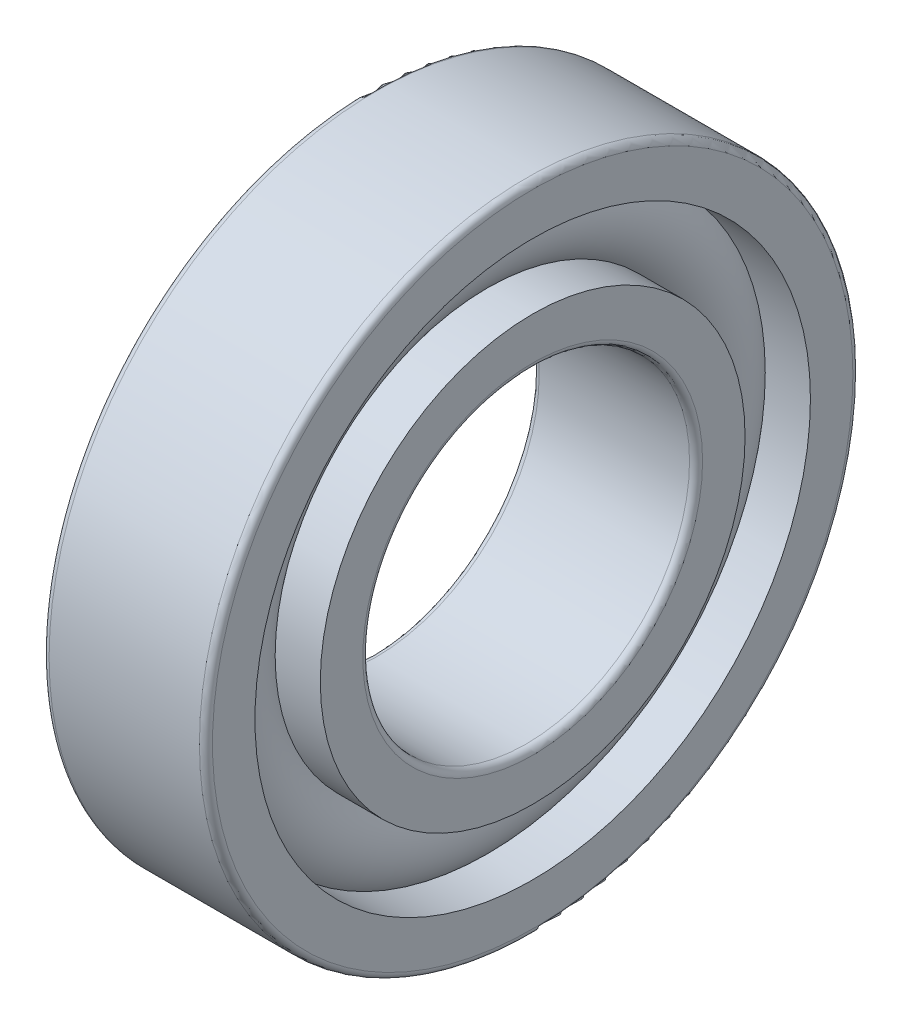
ISO-10303-21;
HEADER;
FILE_DESCRIPTION(('STEP AP214'),'2;1');
FILE_NAME('part.step','',(''),(''),'','','');
FILE_SCHEMA(('AUTOMOTIVE_DESIGN { 1 0 10303 214 1 1 1 1 }'));
ENDSEC;
DATA;
#1=APPLICATION_CONTEXT('core data for automotive mechanical design processes');
#2=APPLICATION_PROTOCOL_DEFINITION('international standard','automotive_design',2000,#1);
#3=PRODUCT_CONTEXT('',#1,'mechanical');
#4=PRODUCT('Part','Part','',(#3));
#5=PRODUCT_RELATED_PRODUCT_CATEGORY('part','',(#4));
#6=PRODUCT_DEFINITION_FORMATION('','',#4);
#7=PRODUCT_DEFINITION_CONTEXT('part definition',#1,'design');
#8=PRODUCT_DEFINITION('design','',#6,#7);
#9=PRODUCT_DEFINITION_SHAPE('','',#8);
#10=(LENGTH_UNIT() NAMED_UNIT(*) SI_UNIT(.MILLI.,.METRE.));
#11=(NAMED_UNIT(*) PLANE_ANGLE_UNIT() SI_UNIT($,.RADIAN.));
#12=(NAMED_UNIT(*) SI_UNIT($,.STERADIAN.) SOLID_ANGLE_UNIT());
#13=UNCERTAINTY_MEASURE_WITH_UNIT(LENGTH_MEASURE(1.E-05),#10,'distance_accuracy_value','');
#14=(GEOMETRIC_REPRESENTATION_CONTEXT(3) GLOBAL_UNCERTAINTY_ASSIGNED_CONTEXT((#13)) GLOBAL_UNIT_ASSIGNED_CONTEXT((#10,
#11,#12)) REPRESENTATION_CONTEXT('',''));
#15=CARTESIAN_POINT('',(0.,0.,0.));
#16=DIRECTION('',(0.,0.,1.));
#17=DIRECTION('',(1.,0.,0.));
#18=AXIS2_PLACEMENT_3D('',#15,#16,#17);
#19=CARTESIAN_POINT('',(0.,0.,0.));
#20=DIRECTION('',(-1.,0.,0.));
#21=DIRECTION('',(0.,0.,1.));
#22=AXIS2_PLACEMENT_3D('',#19,#20,#21);
#23=TOROIDAL_SURFACE('',#22,4.7625,0.9525);
#24=CARTESIAN_POINT('',(0.709951582856179,0.,0.));
#25=DIRECTION('',(-1.,0.,0.));
#26=DIRECTION('',(0.,0.,1.));
#27=AXIS2_PLACEMENT_3D('',#24,#25,#26);
#28=CIRCLE('',#27,5.3975);
#29=CARTESIAN_POINT('',(0.709951582856179,0.,5.3975));
#30=VERTEX_POINT('',#29);
#31=EDGE_CURVE('E35',#30,#30,#28,.F.);
#32=ORIENTED_EDGE('',*,*,#31,.T.);
#33=EDGE_LOOP('',(#32));
#34=FACE_BOUND('',#33,.T.);
#35=CARTESIAN_POINT('',(0.709951582856183,0.,0.));
#36=DIRECTION('',(-1.,0.,0.));
#37=DIRECTION('',(0.,0.,1.));
#38=AXIS2_PLACEMENT_3D('',#35,#36,#37);
#39=CIRCLE('',#38,4.1275);
#40=CARTESIAN_POINT('',(0.709951582856183,0.,4.1275));
#41=VERTEX_POINT('',#40);
#42=EDGE_CURVE('E10',#41,#41,#39,.T.);
#43=ORIENTED_EDGE('',*,*,#42,.T.);
#44=EDGE_LOOP('',(#43));
#45=FACE_BOUND('',#44,.T.);
#46=ADVANCED_FACE('F31',(#34,#45),#23,.T.);
#47=CARTESIAN_POINT('',(-20.6375,0.,0.));
#48=DIRECTION('',(1.,0.,0.));
#49=DIRECTION('',(0.,0.,-1.));
#50=AXIS2_PLACEMENT_3D('',#47,#48,#49);
#51=CYLINDRICAL_SURFACE('',#50,4.1275);
#52=CARTESIAN_POINT('',(1.5875,0.,0.));
#53=DIRECTION('',(1.,0.,0.));
#54=DIRECTION('',(0.,0.,-1.));
#55=AXIS2_PLACEMENT_3D('',#52,#53,#54);
#56=CIRCLE('',#55,4.1275);
#57=CARTESIAN_POINT('',(1.5875,0.,-4.1275));
#58=VERTEX_POINT('',#57);
#59=EDGE_CURVE('E44',#58,#58,#56,.T.);
#60=ORIENTED_EDGE('',*,*,#59,.F.);
#61=EDGE_LOOP('',(#60));
#62=FACE_BOUND('',#61,.T.);
#63=ORIENTED_EDGE('',*,*,#42,.F.);
#64=EDGE_LOOP('',(#63));
#65=FACE_BOUND('',#64,.T.);
#66=ADVANCED_FACE('F83',(#62,#65),#51,.T.);
#67=CARTESIAN_POINT('',(-20.6375,0.,0.));
#68=DIRECTION('',(1.,0.,0.));
#69=DIRECTION('',(0.,0.,-1.));
#70=AXIS2_PLACEMENT_3D('',#67,#68,#69);
#71=CYLINDRICAL_SURFACE('',#70,4.1275);
#72=CARTESIAN_POINT('',(-1.5875,0.,0.));
#73=DIRECTION('',(1.,0.,0.));
#74=DIRECTION('',(0.,0.,-1.));
#75=AXIS2_PLACEMENT_3D('',#72,#73,#74);
#76=CIRCLE('',#75,4.1275);
#77=CARTESIAN_POINT('',(-1.5875,0.,-4.1275));
#78=VERTEX_POINT('',#77);
#79=EDGE_CURVE('E53',#78,#78,#76,.T.);
#80=ORIENTED_EDGE('',*,*,#79,.T.);
#81=EDGE_LOOP('',(#80));
#82=FACE_BOUND('',#81,.T.);
#83=CARTESIAN_POINT('',(-0.709951582856183,0.,0.));
#84=DIRECTION('',(1.,0.,0.));
#85=DIRECTION('',(0.,0.,-1.));
#86=AXIS2_PLACEMENT_3D('',#83,#84,#85);
#87=CIRCLE('',#86,4.1275);
#88=CARTESIAN_POINT('',(-0.709951582856183,0.,-4.1275));
#89=VERTEX_POINT('',#88);
#90=EDGE_CURVE('E39',#89,#89,#87,.T.);
#91=ORIENTED_EDGE('',*,*,#90,.F.);
#92=EDGE_LOOP('',(#91));
#93=FACE_BOUND('',#92,.T.);
#94=ADVANCED_FACE('F86',(#82,#93),#71,.T.);
#95=CARTESIAN_POINT('',(1.5875,3.302,0.));
#96=DIRECTION('',(1.,0.,0.));
#97=DIRECTION('',(0.,0.,-1.));
#98=AXIS2_PLACEMENT_3D('',#95,#96,#97);
#99=PLANE('',#98);
#100=ORIENTED_EDGE('',*,*,#59,.T.);
#101=EDGE_LOOP('',(#100));
#102=FACE_BOUND('',#101,.T.);
#103=CARTESIAN_POINT('',(1.5875,0.,0.));
#104=DIRECTION('',(1.,0.,0.));
#105=DIRECTION('',(0.,0.,-1.));
#106=AXIS2_PLACEMENT_3D('',#103,#104,#105);
#107=CIRCLE('',#106,3.302);
#108=CARTESIAN_POINT('',(1.5875,0.,-3.302));
#109=VERTEX_POINT('',#108);
#110=EDGE_CURVE('E75',#109,#109,#107,.T.);
#111=ORIENTED_EDGE('',*,*,#110,.F.);
#112=EDGE_LOOP('',(#111));
#113=FACE_BOUND('',#112,.T.);
#114=ADVANCED_FACE('F80',(#102,#113),#99,.T.);
#115=CARTESIAN_POINT('',(1.4605,0.,0.));
#116=DIRECTION('',(1.,0.,0.));
#117=DIRECTION('',(0.,0.,-1.));
#118=AXIS2_PLACEMENT_3D('',#115,#116,#117);
#119=TOROIDAL_SURFACE('',#118,3.302,0.127);
#120=ORIENTED_EDGE('',*,*,#110,.T.);
#121=EDGE_LOOP('',(#120));
#122=FACE_BOUND('',#121,.T.);
#123=CARTESIAN_POINT('',(1.4605,0.,0.));
#124=DIRECTION('',(1.,0.,0.));
#125=DIRECTION('',(0.,0.,-1.));
#126=AXIS2_PLACEMENT_3D('',#123,#124,#125);
#127=CIRCLE('',#126,3.175);
#128=CARTESIAN_POINT('',(1.4605,0.,-3.175));
#129=VERTEX_POINT('',#128);
#130=EDGE_CURVE('E72',#129,#129,#127,.T.);
#131=ORIENTED_EDGE('',*,*,#130,.F.);
#132=EDGE_LOOP('',(#131));
#133=FACE_BOUND('',#132,.T.);
#134=ADVANCED_FACE('F97',(#122,#133),#119,.T.);
#135=CARTESIAN_POINT('',(-20.6375,0.,0.));
#136=DIRECTION('',(1.,0.,0.));
#137=DIRECTION('',(0.,0.,-1.));
#138=AXIS2_PLACEMENT_3D('',#135,#136,#137);
#139=CYLINDRICAL_SURFACE('',#138,3.175);
#140=ORIENTED_EDGE('',*,*,#130,.T.);
#141=EDGE_LOOP('',(#140));
#142=FACE_BOUND('',#141,.T.);
#143=CARTESIAN_POINT('',(-1.4605,0.,0.));
#144=DIRECTION('',(1.,0.,0.));
#145=DIRECTION('',(0.,0.,-1.));
#146=AXIS2_PLACEMENT_3D('',#143,#144,#145);
#147=CIRCLE('',#146,3.175);
#148=CARTESIAN_POINT('',(-1.4605,0.,-3.175));
#149=VERTEX_POINT('',#148);
#150=EDGE_CURVE('E69',#149,#149,#147,.T.);
#151=ORIENTED_EDGE('',*,*,#150,.F.);
#152=EDGE_LOOP('',(#151));
#153=FACE_BOUND('',#152,.T.);
#154=ADVANCED_FACE('F100',(#142,#153),#139,.F.);
#155=CARTESIAN_POINT('',(-1.4605,0.,0.));
#156=DIRECTION('',(1.,0.,0.));
#157=DIRECTION('',(0.,0.,-1.));
#158=AXIS2_PLACEMENT_3D('',#155,#156,#157);
#159=TOROIDAL_SURFACE('',#158,3.302,0.127);
#160=ORIENTED_EDGE('',*,*,#150,.T.);
#161=EDGE_LOOP('',(#160));
#162=FACE_BOUND('',#161,.T.);
#163=CARTESIAN_POINT('',(-1.5875,0.,0.));
#164=DIRECTION('',(1.,0.,0.));
#165=DIRECTION('',(0.,0.,-1.));
#166=AXIS2_PLACEMENT_3D('',#163,#164,#165);
#167=CIRCLE('',#166,3.302);
#168=CARTESIAN_POINT('',(-1.5875,0.,-3.302));
#169=VERTEX_POINT('',#168);
#170=EDGE_CURVE('E66',#169,#169,#167,.T.);
#171=ORIENTED_EDGE('',*,*,#170,.F.);
#172=EDGE_LOOP('',(#171));
#173=FACE_BOUND('',#172,.T.);
#174=ADVANCED_FACE('F104',(#162,#173),#159,.T.);
#175=CARTESIAN_POINT('',(-1.5875,4.1275,0.));
#176=DIRECTION('',(-1.,0.,0.));
#177=DIRECTION('',(0.,0.,1.));
#178=AXIS2_PLACEMENT_3D('',#175,#176,#177);
#179=PLANE('',#178);
#180=ORIENTED_EDGE('',*,*,#170,.T.);
#181=EDGE_LOOP('',(#180));
#182=FACE_BOUND('',#181,.T.);
#183=ORIENTED_EDGE('',*,*,#79,.F.);
#184=EDGE_LOOP('',(#183));
#185=FACE_BOUND('',#184,.T.);
#186=ADVANCED_FACE('F108',(#182,#185),#179,.T.);
#187=CARTESIAN_POINT('',(-0.709951582856179,0.,0.));
#188=DIRECTION('',(1.,0.,0.));
#189=DIRECTION('',(0.,0.,-1.));
#190=AXIS2_PLACEMENT_3D('',#187,#188,#189);
#191=CIRCLE('',#190,5.3975);
#192=CARTESIAN_POINT('',(-0.709951582856179,0.,-5.3975));
#193=VERTEX_POINT('',#192);
#194=EDGE_CURVE('E47',#193,#193,#191,.F.);
#195=ORIENTED_EDGE('',*,*,#194,.T.);
#196=EDGE_LOOP('',(#195));
#197=FACE_BOUND('',#196,.T.);
#198=ORIENTED_EDGE('',*,*,#90,.T.);
#199=EDGE_LOOP('',(#198));
#200=FACE_BOUND('',#199,.T.);
#201=ADVANCED_FACE('F33',(#197,#200),#23,.T.);
#202=CARTESIAN_POINT('',(-20.6375,0.,0.));
#203=DIRECTION('',(1.,0.,0.));
#204=DIRECTION('',(0.,0.,-1.));
#205=AXIS2_PLACEMENT_3D('',#202,#203,#204);
#206=CYLINDRICAL_SURFACE('',#205,5.3975);
#207=CARTESIAN_POINT('',(1.5875,0.,0.));
#208=DIRECTION('',(1.,0.,0.));
#209=DIRECTION('',(0.,0.,-1.));
#210=AXIS2_PLACEMENT_3D('',#207,#208,#209);
#211=CIRCLE('',#210,5.3975);
#212=CARTESIAN_POINT('',(1.5875,0.,-5.3975));
#213=VERTEX_POINT('',#212);
#214=EDGE_CURVE('E49',#213,#213,#211,.T.);
#215=ORIENTED_EDGE('',*,*,#214,.T.);
#216=EDGE_LOOP('',(#215));
#217=FACE_BOUND('',#216,.T.);
#218=ORIENTED_EDGE('',*,*,#31,.F.);
#219=EDGE_LOOP('',(#218));
#220=FACE_BOUND('',#219,.T.);
#221=ADVANCED_FACE('F113',(#217,#220),#206,.F.);
#222=CARTESIAN_POINT('',(-20.6375,0.,0.));
#223=DIRECTION('',(1.,0.,0.));
#224=DIRECTION('',(0.,0.,-1.));
#225=AXIS2_PLACEMENT_3D('',#222,#223,#224);
#226=CYLINDRICAL_SURFACE('',#225,5.3975);
#227=CARTESIAN_POINT('',(-1.5875,0.,0.));
#228=DIRECTION('',(1.,0.,0.));
#229=DIRECTION('',(0.,0.,-1.));
#230=AXIS2_PLACEMENT_3D('',#227,#228,#229);
#231=CIRCLE('',#230,5.3975);
#232=CARTESIAN_POINT('',(-1.5875,0.,-5.3975));
#233=VERTEX_POINT('',#232);
#234=EDGE_CURVE('E144',#233,#233,#231,.T.);
#235=ORIENTED_EDGE('',*,*,#234,.F.);
#236=EDGE_LOOP('',(#235));
#237=FACE_BOUND('',#236,.T.);
#238=ORIENTED_EDGE('',*,*,#194,.F.);
#239=EDGE_LOOP('',(#238));
#240=FACE_BOUND('',#239,.T.);
#241=ADVANCED_FACE('F116',(#237,#240),#226,.F.);
#242=CARTESIAN_POINT('',(1.5875,6.223,0.));
#243=DIRECTION('',(1.,0.,0.));
#244=DIRECTION('',(0.,0.,-1.));
#245=AXIS2_PLACEMENT_3D('',#242,#243,#244);
#246=PLANE('',#245);
#247=CARTESIAN_POINT('',(1.5875,0.,0.));
#248=DIRECTION('',(1.,0.,0.));
#249=DIRECTION('',(0.,0.,-1.));
#250=AXIS2_PLACEMENT_3D('',#247,#248,#249);
#251=CIRCLE('',#250,6.223);
#252=CARTESIAN_POINT('',(1.5875,0.,-6.223));
#253=VERTEX_POINT('',#252);
#254=EDGE_CURVE('E55',#253,#253,#251,.T.);
#255=ORIENTED_EDGE('',*,*,#254,.T.);
#256=EDGE_LOOP('',(#255));
#257=FACE_BOUND('',#256,.T.);
#258=ORIENTED_EDGE('',*,*,#214,.F.);
#259=EDGE_LOOP('',(#258));
#260=FACE_BOUND('',#259,.T.);
#261=ADVANCED_FACE('F117',(#257,#260),#246,.T.);
#262=CARTESIAN_POINT('',(1.4605,0.,0.));
#263=DIRECTION('',(1.,0.,0.));
#264=DIRECTION('',(0.,0.,-1.));
#265=AXIS2_PLACEMENT_3D('',#262,#263,#264);
#266=TOROIDAL_SURFACE('',#265,6.223,0.127);
#267=CARTESIAN_POINT('',(1.4605,0.,0.));
#268=DIRECTION('',(1.,0.,0.));
#269=DIRECTION('',(0.,0.,-1.));
#270=AXIS2_PLACEMENT_3D('',#267,#268,#269);
#271=CIRCLE('',#270,6.35);
#272=CARTESIAN_POINT('',(1.4605,0.,-6.35));
#273=VERTEX_POINT('',#272);
#274=EDGE_CURVE('E60',#273,#273,#271,.T.);
#275=ORIENTED_EDGE('',*,*,#274,.T.);
#276=EDGE_LOOP('',(#275));
#277=FACE_BOUND('',#276,.T.);
#278=ORIENTED_EDGE('',*,*,#254,.F.);
#279=EDGE_LOOP('',(#278));
#280=FACE_BOUND('',#279,.T.);
#281=ADVANCED_FACE('F120',(#277,#280),#266,.T.);
#282=CARTESIAN_POINT('',(-20.6375,0.,0.));
#283=DIRECTION('',(1.,0.,0.));
#284=DIRECTION('',(0.,0.,-1.));
#285=AXIS2_PLACEMENT_3D('',#282,#283,#284);
#286=CYLINDRICAL_SURFACE('',#285,6.35);
#287=CARTESIAN_POINT('',(-1.4605,0.,0.));
#288=DIRECTION('',(1.,0.,0.));
#289=DIRECTION('',(0.,0.,-1.));
#290=AXIS2_PLACEMENT_3D('',#287,#288,#289);
#291=CIRCLE('',#290,6.35);
#292=CARTESIAN_POINT('',(-1.4605,0.,-6.35));
#293=VERTEX_POINT('',#292);
#294=EDGE_CURVE('E148',#293,#293,#291,.T.);
#295=ORIENTED_EDGE('',*,*,#294,.T.);
#296=EDGE_LOOP('',(#295));
#297=FACE_BOUND('',#296,.T.);
#298=ORIENTED_EDGE('',*,*,#274,.F.);
#299=EDGE_LOOP('',(#298));
#300=FACE_BOUND('',#299,.T.);
#301=ADVANCED_FACE('F124',(#297,#300),#286,.T.);
#302=CARTESIAN_POINT('',(-1.4605,0.,0.));
#303=DIRECTION('',(1.,0.,0.));
#304=DIRECTION('',(0.,0.,-1.));
#305=AXIS2_PLACEMENT_3D('',#302,#303,#304);
#306=TOROIDAL_SURFACE('',#305,6.223,0.127);
#307=CARTESIAN_POINT('',(-1.5875,0.,0.));
#308=DIRECTION('',(1.,0.,0.));
#309=DIRECTION('',(0.,0.,-1.));
#310=AXIS2_PLACEMENT_3D('',#307,#308,#309);
#311=CIRCLE('',#310,6.223);
#312=CARTESIAN_POINT('',(-1.5875,0.,-6.223));
#313=VERTEX_POINT('',#312);
#314=EDGE_CURVE('E145',#313,#313,#311,.T.);
#315=ORIENTED_EDGE('',*,*,#314,.T.);
#316=EDGE_LOOP('',(#315));
#317=FACE_BOUND('',#316,.T.);
#318=ORIENTED_EDGE('',*,*,#294,.F.);
#319=EDGE_LOOP('',(#318));
#320=FACE_BOUND('',#319,.T.);
#321=ADVANCED_FACE('F128',(#317,#320),#306,.T.);
#322=CARTESIAN_POINT('',(-1.5875,5.3975,0.));
#323=DIRECTION('',(-1.,0.,0.));
#324=DIRECTION('',(0.,0.,1.));
#325=AXIS2_PLACEMENT_3D('',#322,#323,#324);
#326=PLANE('',#325);
#327=ORIENTED_EDGE('',*,*,#234,.T.);
#328=EDGE_LOOP('',(#327));
#329=FACE_BOUND('',#328,.T.);
#330=ORIENTED_EDGE('',*,*,#314,.F.);
#331=EDGE_LOOP('',(#330));
#332=FACE_BOUND('',#331,.T.);
#333=ADVANCED_FACE('F132',(#329,#332),#326,.T.);
#334=CLOSED_SHELL('',(#46,#66,#94,#114,#134,#154,#174,#186,#201,#221,#241,#261,#281,#301,#321,#333));
#335=MANIFOLD_SOLID_BREP('B2',#334);
#336=ADVANCED_BREP_SHAPE_REPRESENTATION('',(#18,#335),#14);
#337=SHAPE_DEFINITION_REPRESENTATION(#9,#336);
ENDSEC;
END-ISO-10303-21;
